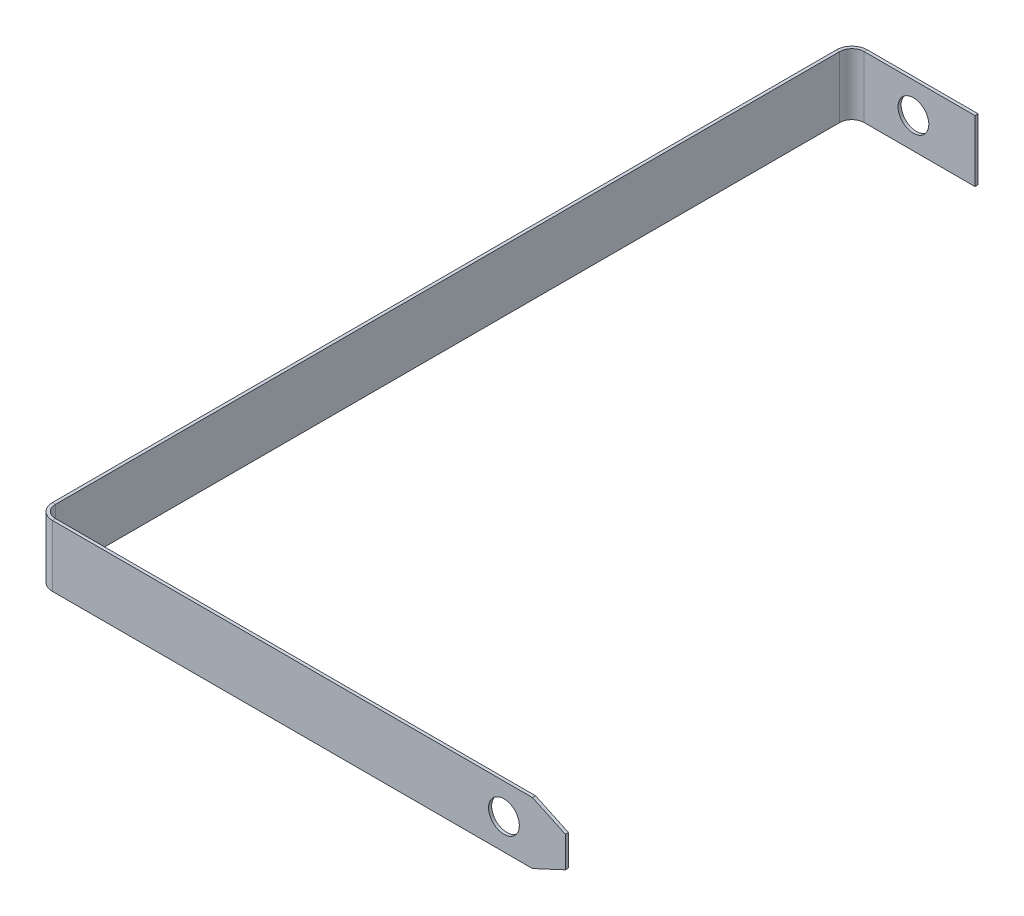
ISO-10303-21;
HEADER;
FILE_DESCRIPTION(('STEP AP214'),'2;1');
FILE_NAME('part.step','',(''),(''),'','','');
FILE_SCHEMA(('AUTOMOTIVE_DESIGN { 1 0 10303 214 1 1 1 1 }'));
ENDSEC;
DATA;
#1=APPLICATION_CONTEXT('core data for automotive mechanical design processes');
#2=APPLICATION_PROTOCOL_DEFINITION('international standard','automotive_design',2000,#1);
#3=PRODUCT_CONTEXT('',#1,'mechanical');
#4=PRODUCT('Part','Part','',(#3));
#5=PRODUCT_RELATED_PRODUCT_CATEGORY('part','',(#4));
#6=PRODUCT_DEFINITION_FORMATION('','',#4);
#7=PRODUCT_DEFINITION_CONTEXT('part definition',#1,'design');
#8=PRODUCT_DEFINITION('design','',#6,#7);
#9=PRODUCT_DEFINITION_SHAPE('','',#8);
#10=(LENGTH_UNIT() NAMED_UNIT(*) SI_UNIT(.MILLI.,.METRE.));
#11=(NAMED_UNIT(*) PLANE_ANGLE_UNIT() SI_UNIT($,.RADIAN.));
#12=(NAMED_UNIT(*) SI_UNIT($,.STERADIAN.) SOLID_ANGLE_UNIT());
#13=UNCERTAINTY_MEASURE_WITH_UNIT(LENGTH_MEASURE(1.E-05),#10,'distance_accuracy_value','');
#14=(GEOMETRIC_REPRESENTATION_CONTEXT(3) GLOBAL_UNCERTAINTY_ASSIGNED_CONTEXT((#13)) GLOBAL_UNIT_ASSIGNED_CONTEXT((#10,
#11,#12)) REPRESENTATION_CONTEXT('',''));
#15=CARTESIAN_POINT('',(0.,0.,0.));
#16=DIRECTION('',(0.,0.,1.));
#17=DIRECTION('',(1.,0.,0.));
#18=AXIS2_PLACEMENT_3D('',#15,#16,#17);
#19=CARTESIAN_POINT('',(-26.1699999999984,4.00000000000921,-3.39451983785322E-13));
#20=DIRECTION('',(-5.36737321255032E-13,-1.,0.));
#21=DIRECTION('',(0.,0.,-1.));
#22=AXIS2_PLACEMENT_3D('',#19,#20,#21);
#23=PLANE('',#22);
#24=DIRECTION('',(-1.,5.36737321255032E-13,0.));
#25=VECTOR('',#24,1.);
#26=CARTESIAN_POINT('',(-26.1699999999995,4.00000000000921,51.9999999999997));
#27=LINE('',#26,#25);
#28=CARTESIAN_POINT('',(-25.9699999999995,4.0000000000091,51.9999999999997));
#29=VERTEX_POINT('',#28);
#30=CARTESIAN_POINT('',(-26.1699999999995,4.00000000000921,51.9999999999997));
#31=VERTEX_POINT('',#30);
#32=EDGE_CURVE('E283',#29,#31,#27,.T.);
#33=ORIENTED_EDGE('',*,*,#32,.F.);
#34=DIRECTION('',(0.,0.,1.));
#35=VECTOR('',#34,1.);
#36=CARTESIAN_POINT('',(-25.9699999999984,4.00000000000911,-3.35409080406372E-13));
#37=LINE('',#36,#35);
#38=CARTESIAN_POINT('',(-25.9699999999984,4.00000000000911,0.999999999999664));
#39=VERTEX_POINT('',#38);
#40=EDGE_CURVE('E71',#29,#39,#37,.F.);
#41=ORIENTED_EDGE('',*,*,#40,.T.);
#42=DIRECTION('',(-1.,5.36737321255032E-13,0.));
#43=VECTOR('',#42,1.);
#44=CARTESIAN_POINT('',(-26.1699999999984,4.00000000000921,0.99999999999966));
#45=LINE('',#44,#43);
#46=CARTESIAN_POINT('',(-26.1699999999984,4.00000000000921,0.99999999999966));
#47=VERTEX_POINT('',#46);
#48=EDGE_CURVE('E289',#39,#47,#45,.T.);
#49=ORIENTED_EDGE('',*,*,#48,.T.);
#50=DIRECTION('',(0.,0.,-1.));
#51=VECTOR('',#50,1.);
#52=CARTESIAN_POINT('',(-26.1699999999984,4.00000000000921,-3.39451983785322E-13));
#53=LINE('',#52,#51);
#54=EDGE_CURVE('E268',#31,#47,#53,.T.);
#55=ORIENTED_EDGE('',*,*,#54,.F.);
#56=EDGE_LOOP('',(#33,#41,#49,#55));
#57=FACE_BOUND('',#56,.T.);
#58=ADVANCED_FACE('F49',(#57),#23,.F.);
#59=CARTESIAN_POINT('',(-26.1700000000006,9.21224901917483E-12,-3.39622397293124E-13));
#60=DIRECTION('',(-5.36737321255032E-13,-1.,0.));
#61=DIRECTION('',(0.,0.,-1.));
#62=AXIS2_PLACEMENT_3D('',#59,#60,#61);
#63=PLANE('',#62);
#64=DIRECTION('',(-1.,5.36737321255032E-13,0.));
#65=VECTOR('',#64,1.);
#66=CARTESIAN_POINT('',(-26.1700000000006,9.21224901917483E-12,0.99999999999966));
#67=LINE('',#66,#65);
#68=CARTESIAN_POINT('',(-25.9700000000006,9.10556352540226E-12,0.999999999999664));
#69=VERTEX_POINT('',#68);
#70=CARTESIAN_POINT('',(-26.1700000000006,9.21224901917483E-12,0.99999999999966));
#71=VERTEX_POINT('',#70);
#72=EDGE_CURVE('E11',#69,#71,#67,.T.);
#73=ORIENTED_EDGE('',*,*,#72,.F.);
#74=DIRECTION('',(0.,0.,1.));
#75=VECTOR('',#74,1.);
#76=CARTESIAN_POINT('',(-25.9700000000006,9.10556352540226E-12,-3.35579493914174E-13));
#77=LINE('',#76,#75);
#78=CARTESIAN_POINT('',(-25.9700000000016,9.1029614401883E-12,51.9999999999997));
#79=VERTEX_POINT('',#78);
#80=EDGE_CURVE('E63',#79,#69,#77,.F.);
#81=ORIENTED_EDGE('',*,*,#80,.F.);
#82=DIRECTION('',(-1.,5.36737321255032E-13,0.));
#83=VECTOR('',#82,1.);
#84=CARTESIAN_POINT('',(-26.1700000000016,9.20964693396087E-12,51.9999999999997));
#85=LINE('',#84,#83);
#86=CARTESIAN_POINT('',(-26.1700000000016,9.20964693396087E-12,51.9999999999997));
#87=VERTEX_POINT('',#86);
#88=EDGE_CURVE('E277',#79,#87,#85,.T.);
#89=ORIENTED_EDGE('',*,*,#88,.T.);
#90=DIRECTION('',(0.,0.,-1.));
#91=VECTOR('',#90,1.);
#92=CARTESIAN_POINT('',(-26.1700000000006,9.21224901917483E-12,-3.39622397293124E-13));
#93=LINE('',#92,#91);
#94=EDGE_CURVE('E270',#87,#71,#93,.T.);
#95=ORIENTED_EDGE('',*,*,#94,.T.);
#96=EDGE_LOOP('',(#73,#81,#89,#95));
#97=FACE_BOUND('',#96,.T.);
#98=ADVANCED_FACE('F356',(#97),#63,.T.);
#99=CARTESIAN_POINT('',(-26.1700000000006,9.21224901917483E-12,-3.39622397293124E-13));
#100=DIRECTION('',(1.,-5.36737321255032E-13,0.));
#101=DIRECTION('',(0.,0.,1.));
#102=AXIS2_PLACEMENT_3D('',#99,#100,#101);
#103=PLANE('',#102);
#104=ORIENTED_EDGE('',*,*,#54,.T.);
#105=DIRECTION('',(-5.36737321255032E-13,-1.,0.));
#106=VECTOR('',#105,1.);
#107=CARTESIAN_POINT('',(-26.1700000000006,9.21224901917483E-12,0.99999999999966));
#108=LINE('',#107,#106);
#109=EDGE_CURVE('E286',#47,#71,#108,.T.);
#110=ORIENTED_EDGE('',*,*,#109,.T.);
#111=ORIENTED_EDGE('',*,*,#94,.F.);
#112=DIRECTION('',(5.36737321255032E-13,1.,0.));
#113=VECTOR('',#112,1.);
#114=CARTESIAN_POINT('',(-26.1700000000016,9.20964693396087E-12,51.9999999999997));
#115=LINE('',#114,#113);
#116=EDGE_CURVE('E272',#87,#31,#115,.T.);
#117=ORIENTED_EDGE('',*,*,#116,.T.);
#118=EDGE_LOOP('',(#104,#110,#111,#117));
#119=FACE_BOUND('',#118,.T.);
#120=ADVANCED_FACE('F303',(#119),#103,.F.);
#121=CARTESIAN_POINT('',(-25.9700000000006,9.10556352540226E-12,-3.35579493914174E-13));
#122=DIRECTION('',(1.,-5.36737321255032E-13,0.));
#123=DIRECTION('',(0.,0.,1.));
#124=AXIS2_PLACEMENT_3D('',#121,#122,#123);
#125=PLANE('',#124);
#126=ORIENTED_EDGE('',*,*,#40,.F.);
#127=DIRECTION('',(5.36737321255032E-13,1.,0.));
#128=VECTOR('',#127,1.);
#129=CARTESIAN_POINT('',(-25.9700000000016,9.1029614401883E-12,51.9999999999997));
#130=LINE('',#129,#128);
#131=EDGE_CURVE('E280',#79,#29,#130,.T.);
#132=ORIENTED_EDGE('',*,*,#131,.F.);
#133=ORIENTED_EDGE('',*,*,#80,.T.);
#134=DIRECTION('',(-5.36737321255032E-13,-1.,0.));
#135=VECTOR('',#134,1.);
#136=CARTESIAN_POINT('',(-25.9700000000006,9.10556352540226E-12,0.999999999999664));
#137=LINE('',#136,#135);
#138=EDGE_CURVE('E56',#39,#69,#137,.T.);
#139=ORIENTED_EDGE('',*,*,#138,.F.);
#140=EDGE_LOOP('',(#126,#132,#133,#139));
#141=FACE_BOUND('',#140,.T.);
#142=ADVANCED_FACE('F296',(#141),#125,.T.);
#143=CARTESIAN_POINT('',(-25.1699999999995,4.00000000000867,51.9999999999997));
#144=DIRECTION('',(5.36737321255032E-13,1.,0.));
#145=DIRECTION('',(0.,0.,-1.));
#146=AXIS2_PLACEMENT_3D('',#143,#144,#145);
#147=PLANE('',#146);
#148=DIRECTION('',(0.,0.,1.));
#149=VECTOR('',#148,1.);
#150=CARTESIAN_POINT('',(-25.1699999999995,4.00000000000867,52.9999999999997));
#151=LINE('',#150,#149);
#152=CARTESIAN_POINT('',(-25.1699999999995,4.00000000000867,52.7999999999997));
#153=VERTEX_POINT('',#152);
#154=CARTESIAN_POINT('',(-25.1699999999995,4.00000000000867,52.9999999999997));
#155=VERTEX_POINT('',#154);
#156=EDGE_CURVE('E211',#153,#155,#151,.T.);
#157=ORIENTED_EDGE('',*,*,#156,.F.);
#158=CARTESIAN_POINT('',(-25.1699999999995,4.00000000000867,51.9999999999997));
#159=DIRECTION('',(5.36737321255032E-13,1.,0.));
#160=DIRECTION('',(0.,0.,-1.));
#161=AXIS2_PLACEMENT_3D('',#158,#159,#160);
#162=CIRCLE('',#161,0.8);
#163=EDGE_CURVE('E214',#153,#29,#162,.F.);
#164=ORIENTED_EDGE('',*,*,#163,.T.);
#165=ORIENTED_EDGE('',*,*,#32,.T.);
#166=CARTESIAN_POINT('',(-25.1699999999995,4.00000000000867,51.9999999999997));
#167=DIRECTION('',(-5.36737321255032E-13,-1.,0.));
#168=DIRECTION('',(0.,0.,1.));
#169=AXIS2_PLACEMENT_3D('',#166,#167,#168);
#170=CIRCLE('',#169,1.);
#171=EDGE_CURVE('E257',#155,#31,#170,.T.);
#172=ORIENTED_EDGE('',*,*,#171,.F.);
#173=EDGE_LOOP('',(#157,#164,#165,#172));
#174=FACE_BOUND('',#173,.T.);
#175=ADVANCED_FACE('F309',(#174),#147,.T.);
#176=CARTESIAN_POINT('',(-25.1700000000016,8.67275001814605E-12,51.9999999999997));
#177=DIRECTION('',(-5.36737321255032E-13,-1.,0.));
#178=DIRECTION('',(0.,0.,1.));
#179=AXIS2_PLACEMENT_3D('',#176,#177,#178);
#180=PLANE('',#179);
#181=ORIENTED_EDGE('',*,*,#88,.F.);
#182=CARTESIAN_POINT('',(-25.1700000000016,8.67275001814605E-12,51.9999999999997));
#183=DIRECTION('',(5.36737321255032E-13,1.,0.));
#184=DIRECTION('',(0.,0.,-1.));
#185=AXIS2_PLACEMENT_3D('',#182,#183,#184);
#186=CIRCLE('',#185,0.8);
#187=CARTESIAN_POINT('',(-25.1700000000016,8.67275001814605E-12,52.7999999999997));
#188=VERTEX_POINT('',#187);
#189=EDGE_CURVE('E261',#79,#188,#186,.T.);
#190=ORIENTED_EDGE('',*,*,#189,.T.);
#191=DIRECTION('',(0.,0.,1.));
#192=VECTOR('',#191,1.);
#193=CARTESIAN_POINT('',(-25.1700000000016,8.67275001814605E-12,52.9999999999997));
#194=LINE('',#193,#192);
#195=CARTESIAN_POINT('',(-25.1700000000016,8.67275001814605E-12,52.9999999999997));
#196=VERTEX_POINT('',#195);
#197=EDGE_CURVE('E252',#188,#196,#194,.T.);
#198=ORIENTED_EDGE('',*,*,#197,.T.);
#199=CARTESIAN_POINT('',(-25.1700000000016,8.67275001814605E-12,51.9999999999997));
#200=DIRECTION('',(5.36737321255032E-13,1.,0.));
#201=DIRECTION('',(0.,0.,-1.));
#202=AXIS2_PLACEMENT_3D('',#199,#200,#201);
#203=CIRCLE('',#202,1.);
#204=EDGE_CURVE('E260',#87,#196,#203,.T.);
#205=ORIENTED_EDGE('',*,*,#204,.F.);
#206=EDGE_LOOP('',(#181,#190,#198,#205));
#207=FACE_BOUND('',#206,.T.);
#208=ADVANCED_FACE('F325',(#207),#180,.T.);
#209=CARTESIAN_POINT('',(-25.1700000000028,-2.24718670311854,51.9999999999997));
#210=DIRECTION('',(5.36737321255032E-13,1.,0.));
#211=DIRECTION('',(0.,0.,-1.));
#212=AXIS2_PLACEMENT_3D('',#209,#210,#211);
#213=CYLINDRICAL_SURFACE('',#212,1.);
#214=ORIENTED_EDGE('',*,*,#204,.T.);
#215=DIRECTION('',(-5.36737321255032E-13,-1.,0.));
#216=VECTOR('',#215,1.);
#217=CARTESIAN_POINT('',(-25.1700000000016,8.67275001814605E-12,52.9999999999997));
#218=LINE('',#217,#216);
#219=EDGE_CURVE('E230',#155,#196,#218,.T.);
#220=ORIENTED_EDGE('',*,*,#219,.F.);
#221=ORIENTED_EDGE('',*,*,#171,.T.);
#222=ORIENTED_EDGE('',*,*,#116,.F.);
#223=EDGE_LOOP('',(#214,#220,#221,#222));
#224=FACE_BOUND('',#223,.T.);
#225=ADVANCED_FACE('F312',(#224),#213,.T.);
#226=CARTESIAN_POINT('',(-25.1700000000028,-2.24718670311854,51.9999999999997));
#227=DIRECTION('',(5.36737321255032E-13,1.,0.));
#228=DIRECTION('',(0.,0.,-1.));
#229=AXIS2_PLACEMENT_3D('',#226,#227,#228);
#230=CYLINDRICAL_SURFACE('',#229,0.8);
#231=ORIENTED_EDGE('',*,*,#189,.F.);
#232=ORIENTED_EDGE('',*,*,#131,.T.);
#233=ORIENTED_EDGE('',*,*,#163,.F.);
#234=DIRECTION('',(-5.36737321255032E-13,-1.,0.));
#235=VECTOR('',#234,1.);
#236=CARTESIAN_POINT('',(-25.1700000000016,8.67275001814605E-12,52.7999999999997));
#237=LINE('',#236,#235);
#238=EDGE_CURVE('E205',#153,#188,#237,.T.);
#239=ORIENTED_EDGE('',*,*,#238,.T.);
#240=EDGE_LOOP('',(#231,#232,#233,#239));
#241=FACE_BOUND('',#240,.T.);
#242=ADVANCED_FACE('F329',(#241),#230,.F.);
#243=CARTESIAN_POINT('',(8.19999999999999,2.99999999999076,53.0000000000004));
#244=DIRECTION('',(0.42261826174118,0.906307787036426,0.));
#245=DIRECTION('',(0.906307787036426,-0.42261826174118,0.));
#246=AXIS2_PLACEMENT_3D('',#243,#244,#245);
#247=PLANE('',#246);
#248=DIRECTION('',(0.,0.,1.));
#249=VECTOR('',#248,1.);
#250=CARTESIAN_POINT('',(8.19999999999999,2.99999999999076,53.0000000000004));
#251=LINE('',#250,#249);
#252=CARTESIAN_POINT('',(8.19999999999999,2.99999999999076,52.8000000000004));
#253=VERTEX_POINT('',#252);
#254=CARTESIAN_POINT('',(8.19999999999999,2.99999999999076,53.0000000000004));
#255=VERTEX_POINT('',#254);
#256=EDGE_CURVE('E242',#253,#255,#251,.T.);
#257=ORIENTED_EDGE('',*,*,#256,.F.);
#258=DIRECTION('',(0.906307787036426,-0.42261826174118,0.));
#259=VECTOR('',#258,1.);
#260=CARTESIAN_POINT('',(8.19999999999999,2.99999999999076,52.8000000000004));
#261=LINE('',#260,#259);
#262=CARTESIAN_POINT('',(6.05549307949094,3.99999999999191,52.8000000000003));
#263=VERTEX_POINT('',#262);
#264=EDGE_CURVE('E220',#263,#253,#261,.T.);
#265=ORIENTED_EDGE('',*,*,#264,.F.);
#266=DIRECTION('',(0.,0.,1.));
#267=VECTOR('',#266,1.);
#268=CARTESIAN_POINT('',(6.05549307949093,3.99999999999191,53.0000000000003));
#269=LINE('',#268,#267);
#270=CARTESIAN_POINT('',(6.05549307949093,3.99999999999191,53.0000000000003));
#271=VERTEX_POINT('',#270);
#272=EDGE_CURVE('E250',#263,#271,#269,.T.);
#273=ORIENTED_EDGE('',*,*,#272,.T.);
#274=DIRECTION('',(0.906307787036426,-0.42261826174118,0.));
#275=VECTOR('',#274,1.);
#276=CARTESIAN_POINT('',(8.19999999999999,2.99999999999076,53.0000000000004));
#277=LINE('',#276,#275);
#278=EDGE_CURVE('E247',#271,#255,#277,.T.);
#279=ORIENTED_EDGE('',*,*,#278,.T.);
#280=EDGE_LOOP('',(#257,#265,#273,#279));
#281=FACE_BOUND('',#280,.T.);
#282=ADVANCED_FACE('F337',(#281),#247,.T.);
#283=CARTESIAN_POINT('',(8.19999999999838,-9.2374025095765E-12,53.0000000000004));
#284=DIRECTION('',(-1.,5.36737321255032E-13,0.));
#285=DIRECTION('',(5.36737321255032E-13,1.,0.));
#286=AXIS2_PLACEMENT_3D('',#283,#284,#285);
#287=PLANE('',#286);
#288=DIRECTION('',(0.,0.,1.));
#289=VECTOR('',#288,1.);
#290=CARTESIAN_POINT('',(8.19999999999891,0.999999999990763,53.0000000000004));
#291=LINE('',#290,#289);
#292=CARTESIAN_POINT('',(8.19999999999892,0.999999999990763,52.8000000000004));
#293=VERTEX_POINT('',#292);
#294=CARTESIAN_POINT('',(8.19999999999891,0.999999999990763,53.0000000000004));
#295=VERTEX_POINT('',#294);
#296=EDGE_CURVE('E240',#293,#295,#291,.T.);
#297=ORIENTED_EDGE('',*,*,#296,.F.);
#298=DIRECTION('',(-5.36737321255032E-13,-1.,0.));
#299=VECTOR('',#298,1.);
#300=CARTESIAN_POINT('',(8.19999999999838,-9.2374025095765E-12,52.8000000000004));
#301=LINE('',#300,#299);
#302=EDGE_CURVE('E244',#293,#253,#301,.F.);
#303=ORIENTED_EDGE('',*,*,#302,.T.);
#304=ORIENTED_EDGE('',*,*,#256,.T.);
#305=DIRECTION('',(5.36737321255032E-13,1.,0.));
#306=VECTOR('',#305,1.);
#307=CARTESIAN_POINT('',(8.19999999999838,-9.2374025095765E-12,53.0000000000004));
#308=LINE('',#307,#306);
#309=EDGE_CURVE('E234',#295,#255,#308,.T.);
#310=ORIENTED_EDGE('',*,*,#309,.F.);
#311=EDGE_LOOP('',(#297,#303,#304,#310));
#312=FACE_BOUND('',#311,.T.);
#313=ADVANCED_FACE('F340',(#312),#287,.F.);
#314=CARTESIAN_POINT('',(8.19999999999891,0.999999999990763,53.0000000000004));
#315=DIRECTION('',(0.422618261740208,-0.90630778703688,0.));
#316=DIRECTION('',(-0.90630778703688,-0.422618261740208,0.));
#317=AXIS2_PLACEMENT_3D('',#314,#315,#316);
#318=PLANE('',#317);
#319=DIRECTION('',(0.,0.,1.));
#320=VECTOR('',#319,1.);
#321=CARTESIAN_POINT('',(6.05549307948879,-8.08641348326589E-12,53.0000000000003));
#322=LINE('',#321,#320);
#323=CARTESIAN_POINT('',(6.05549307948879,-8.08641348326589E-12,52.8000000000003));
#324=VERTEX_POINT('',#323);
#325=CARTESIAN_POINT('',(6.05549307948879,-8.08641348326589E-12,53.0000000000003));
#326=VERTEX_POINT('',#325);
#327=EDGE_CURVE('E228',#324,#326,#322,.T.);
#328=ORIENTED_EDGE('',*,*,#327,.F.);
#329=DIRECTION('',(-0.90630778703688,-0.422618261740208,0.));
#330=VECTOR('',#329,1.);
#331=CARTESIAN_POINT('',(8.19999999999892,0.999999999990763,52.8000000000004));
#332=LINE('',#331,#330);
#333=EDGE_CURVE('E217',#293,#324,#332,.T.);
#334=ORIENTED_EDGE('',*,*,#333,.F.);
#335=ORIENTED_EDGE('',*,*,#296,.T.);
#336=DIRECTION('',(-0.90630778703688,-0.422618261740208,0.));
#337=VECTOR('',#336,1.);
#338=CARTESIAN_POINT('',(8.19999999999891,0.999999999990763,53.0000000000004));
#339=LINE('',#338,#337);
#340=EDGE_CURVE('E237',#295,#326,#339,.T.);
#341=ORIENTED_EDGE('',*,*,#340,.T.);
#342=EDGE_LOOP('',(#328,#334,#335,#341));
#343=FACE_BOUND('',#342,.T.);
#344=ADVANCED_FACE('F344',(#343),#318,.T.);
#345=CARTESIAN_POINT('',(-26.1700000000016,9.20964693396087E-12,52.9999999999997));
#346=DIRECTION('',(0.,0.,-1.));
#347=DIRECTION('',(1.,-5.36737321255032E-13,0.));
#348=AXIS2_PLACEMENT_3D('',#345,#346,#347);
#349=PLANE('',#348);
#350=CARTESIAN_POINT('',(4.19999999999945,1.99999999999291,53.0000000000003));
#351=DIRECTION('',(0.,0.,-1.));
#352=DIRECTION('',(1.,-5.36737321255032E-13,0.));
#353=AXIS2_PLACEMENT_3D('',#350,#351,#352);
#354=CIRCLE('',#353,1.);
#355=CARTESIAN_POINT('',(5.19999999999945,1.99999999999237,53.0000000000003));
#356=VERTEX_POINT('',#355);
#357=EDGE_CURVE('E197',#356,#356,#354,.T.);
#358=ORIENTED_EDGE('',*,*,#357,.T.);
#359=EDGE_LOOP('',(#358));
#360=FACE_BOUND('',#359,.T.);
#361=DIRECTION('',(-1.,5.36737321255032E-13,0.));
#362=VECTOR('',#361,1.);
#363=CARTESIAN_POINT('',(-26.1700000000016,9.20964693396087E-12,52.9999999999997));
#364=LINE('',#363,#362);
#365=EDGE_CURVE('E225',#326,#196,#364,.T.);
#366=ORIENTED_EDGE('',*,*,#365,.F.);
#367=ORIENTED_EDGE('',*,*,#340,.F.);
#368=ORIENTED_EDGE('',*,*,#309,.T.);
#369=ORIENTED_EDGE('',*,*,#278,.F.);
#370=DIRECTION('',(-1.,5.36737321255032E-13,0.));
#371=VECTOR('',#370,1.);
#372=CARTESIAN_POINT('',(-26.1699999999995,4.00000000000921,52.9999999999997));
#373=LINE('',#372,#371);
#374=EDGE_CURVE('E232',#271,#155,#373,.T.);
#375=ORIENTED_EDGE('',*,*,#374,.T.);
#376=ORIENTED_EDGE('',*,*,#219,.T.);
#377=EDGE_LOOP('',(#366,#367,#368,#369,#375,#376));
#378=FACE_BOUND('',#377,.T.);
#379=ADVANCED_FACE('F315',(#360,#378),#349,.F.);
#380=CARTESIAN_POINT('',(-26.1700000000016,9.20964693396087E-12,52.9999999999997));
#381=DIRECTION('',(-5.36737321255032E-13,-1.,0.));
#382=DIRECTION('',(-1.,5.36737321255032E-13,0.));
#383=AXIS2_PLACEMENT_3D('',#380,#381,#382);
#384=PLANE('',#383);
#385=DIRECTION('',(1.,-5.36737321255032E-13,0.));
#386=VECTOR('',#385,1.);
#387=CARTESIAN_POINT('',(-26.1700000000016,9.20964693396087E-12,52.7999999999997));
#388=LINE('',#387,#386);
#389=EDGE_CURVE('E223',#324,#188,#388,.F.);
#390=ORIENTED_EDGE('',*,*,#389,.F.);
#391=ORIENTED_EDGE('',*,*,#327,.T.);
#392=ORIENTED_EDGE('',*,*,#365,.T.);
#393=ORIENTED_EDGE('',*,*,#197,.F.);
#394=EDGE_LOOP('',(#390,#391,#392,#393));
#395=FACE_BOUND('',#394,.T.);
#396=ADVANCED_FACE('F322',(#395),#384,.T.);
#397=CARTESIAN_POINT('',(-26.1700000000016,9.20964693396087E-12,52.7999999999997));
#398=DIRECTION('',(0.,0.,-1.));
#399=DIRECTION('',(1.,-5.36737321255032E-13,0.));
#400=AXIS2_PLACEMENT_3D('',#397,#398,#399);
#401=PLANE('',#400);
#402=CARTESIAN_POINT('',(4.19999999999945,1.99999999999291,52.8000000000003));
#403=DIRECTION('',(0.,0.,-1.));
#404=DIRECTION('',(1.,-5.36737321255032E-13,0.));
#405=AXIS2_PLACEMENT_3D('',#402,#403,#404);
#406=CIRCLE('',#405,1.);
#407=CARTESIAN_POINT('',(5.19999999999945,1.99999999999237,52.8000000000003));
#408=VERTEX_POINT('',#407);
#409=EDGE_CURVE('E610',#408,#408,#406,.T.);
#410=ORIENTED_EDGE('',*,*,#409,.F.);
#411=EDGE_LOOP('',(#410));
#412=FACE_BOUND('',#411,.T.);
#413=ORIENTED_EDGE('',*,*,#389,.T.);
#414=ORIENTED_EDGE('',*,*,#238,.F.);
#415=DIRECTION('',(1.,-5.36737321255032E-13,0.));
#416=VECTOR('',#415,1.);
#417=CARTESIAN_POINT('',(-26.1699999999995,4.00000000000921,52.7999999999997));
#418=LINE('',#417,#416);
#419=EDGE_CURVE('E215',#263,#153,#418,.F.);
#420=ORIENTED_EDGE('',*,*,#419,.F.);
#421=ORIENTED_EDGE('',*,*,#264,.T.);
#422=ORIENTED_EDGE('',*,*,#302,.F.);
#423=ORIENTED_EDGE('',*,*,#333,.T.);
#424=EDGE_LOOP('',(#413,#414,#420,#421,#422,#423));
#425=FACE_BOUND('',#424,.T.);
#426=ADVANCED_FACE('F332',(#412,#425),#401,.T.);
#427=CARTESIAN_POINT('',(-26.1699999999995,4.00000000000921,52.9999999999997));
#428=DIRECTION('',(-5.36737321255032E-13,-1.,0.));
#429=DIRECTION('',(-1.,5.36737321255032E-13,0.));
#430=AXIS2_PLACEMENT_3D('',#427,#428,#429);
#431=PLANE('',#430);
#432=ORIENTED_EDGE('',*,*,#272,.F.);
#433=ORIENTED_EDGE('',*,*,#419,.T.);
#434=ORIENTED_EDGE('',*,*,#156,.T.);
#435=ORIENTED_EDGE('',*,*,#374,.F.);
#436=EDGE_LOOP('',(#432,#433,#434,#435));
#437=FACE_BOUND('',#436,.T.);
#438=ADVANCED_FACE('F335',(#437),#431,.F.);
#439=CARTESIAN_POINT('',(-25.1699999999984,4.00000000000868,0.999999999999681));
#440=DIRECTION('',(5.36737321255032E-13,1.,0.));
#441=DIRECTION('',(0.,0.,-1.));
#442=AXIS2_PLACEMENT_3D('',#439,#440,#441);
#443=PLANE('',#442);
#444=ORIENTED_EDGE('',*,*,#48,.F.);
#445=CARTESIAN_POINT('',(-25.1699999999984,4.00000000000868,0.999999999999681));
#446=DIRECTION('',(-5.36737321255032E-13,-1.,0.));
#447=DIRECTION('',(0.,0.,1.));
#448=AXIS2_PLACEMENT_3D('',#445,#446,#447);
#449=CIRCLE('',#448,0.8);
#450=CARTESIAN_POINT('',(-25.1699999999984,4.00000000000868,0.199999999999679));
#451=VERTEX_POINT('',#450);
#452=EDGE_CURVE('E208',#39,#451,#449,.T.);
#453=ORIENTED_EDGE('',*,*,#452,.T.);
#454=DIRECTION('',(0.,0.,-1.));
#455=VECTOR('',#454,1.);
#456=CARTESIAN_POINT('',(-25.1699999999984,4.00000000000868,-3.19368389417059E-13));
#457=LINE('',#456,#455);
#458=CARTESIAN_POINT('',(-25.1699999999984,4.00000000000868,-3.19368389417059E-13));
#459=VERTEX_POINT('',#458);
#460=EDGE_CURVE('E161',#451,#459,#457,.T.);
#461=ORIENTED_EDGE('',*,*,#460,.T.);
#462=CARTESIAN_POINT('',(-25.1699999999984,4.00000000000868,0.999999999999681));
#463=DIRECTION('',(-5.36737321255032E-13,-1.,0.));
#464=DIRECTION('',(0.,0.,1.));
#465=AXIS2_PLACEMENT_3D('',#462,#463,#464);
#466=CIRCLE('',#465,1.);
#467=EDGE_CURVE('E198',#47,#459,#466,.T.);
#468=ORIENTED_EDGE('',*,*,#467,.F.);
#469=EDGE_LOOP('',(#444,#453,#461,#468));
#470=FACE_BOUND('',#469,.T.);
#471=ADVANCED_FACE('F299',(#470),#443,.T.);
#472=CARTESIAN_POINT('',(-25.1700000000006,8.67535210336001E-12,0.99999999999968));
#473=DIRECTION('',(-5.36737321255032E-13,-1.,0.));
#474=DIRECTION('',(0.,0.,1.));
#475=AXIS2_PLACEMENT_3D('',#472,#473,#474);
#476=PLANE('',#475);
#477=DIRECTION('',(0.,0.,-1.));
#478=VECTOR('',#477,1.);
#479=CARTESIAN_POINT('',(-25.1700000000006,8.67535210336001E-12,-3.19538802924861E-13));
#480=LINE('',#479,#478);
#481=CARTESIAN_POINT('',(-25.1700000000006,8.67535210336001E-12,0.199999999999679));
#482=VERTEX_POINT('',#481);
#483=CARTESIAN_POINT('',(-25.1700000000006,8.67535210336001E-12,-3.19538802924861E-13));
#484=VERTEX_POINT('',#483);
#485=EDGE_CURVE('E174',#482,#484,#480,.T.);
#486=ORIENTED_EDGE('',*,*,#485,.F.);
#487=CARTESIAN_POINT('',(-25.1700000000006,8.67535210336001E-12,0.99999999999968));
#488=DIRECTION('',(-5.36737321255032E-13,-1.,0.));
#489=DIRECTION('',(0.,0.,1.));
#490=AXIS2_PLACEMENT_3D('',#487,#488,#489);
#491=CIRCLE('',#490,0.8);
#492=EDGE_CURVE('E202',#482,#69,#491,.F.);
#493=ORIENTED_EDGE('',*,*,#492,.T.);
#494=ORIENTED_EDGE('',*,*,#72,.T.);
#495=CARTESIAN_POINT('',(-25.1700000000006,8.67535210336001E-12,0.99999999999968));
#496=DIRECTION('',(5.36737321255032E-13,1.,0.));
#497=DIRECTION('',(0.,0.,-1.));
#498=AXIS2_PLACEMENT_3D('',#495,#496,#497);
#499=CIRCLE('',#498,1.);
#500=EDGE_CURVE('E201',#484,#71,#499,.T.);
#501=ORIENTED_EDGE('',*,*,#500,.F.);
#502=EDGE_LOOP('',(#486,#493,#494,#501));
#503=FACE_BOUND('',#502,.T.);
#504=ADVANCED_FACE('F476',(#503),#476,.T.);
#505=CARTESIAN_POINT('',(-25.1699999999972,6.24718670313589,0.999999999999681));
#506=DIRECTION('',(-5.36737321255032E-13,-1.,0.));
#507=DIRECTION('',(0.,0.,1.));
#508=AXIS2_PLACEMENT_3D('',#505,#506,#507);
#509=CYLINDRICAL_SURFACE('',#508,1.);
#510=ORIENTED_EDGE('',*,*,#500,.T.);
#511=ORIENTED_EDGE('',*,*,#109,.F.);
#512=ORIENTED_EDGE('',*,*,#467,.T.);
#513=DIRECTION('',(5.36737321255032E-13,1.,0.));
#514=VECTOR('',#513,1.);
#515=CARTESIAN_POINT('',(-25.1700000000006,8.67535210336001E-12,-3.19538802924861E-13));
#516=LINE('',#515,#514);
#517=EDGE_CURVE('E185',#484,#459,#516,.T.);
#518=ORIENTED_EDGE('',*,*,#517,.F.);
#519=EDGE_LOOP('',(#510,#511,#512,#518));
#520=FACE_BOUND('',#519,.T.);
#521=ADVANCED_FACE('F473',(#520),#509,.T.);
#522=CARTESIAN_POINT('',(-25.1699999999972,6.24718670313589,0.999999999999681));
#523=DIRECTION('',(-5.36737321255032E-13,-1.,0.));
#524=DIRECTION('',(0.,0.,1.));
#525=AXIS2_PLACEMENT_3D('',#522,#523,#524);
#526=CYLINDRICAL_SURFACE('',#525,0.8);
#527=ORIENTED_EDGE('',*,*,#492,.F.);
#528=DIRECTION('',(5.36737321255032E-13,1.,0.));
#529=VECTOR('',#528,1.);
#530=CARTESIAN_POINT('',(-25.1700000000006,8.67535210336001E-12,0.199999999999679));
#531=LINE('',#530,#529);
#532=EDGE_CURVE('E169',#482,#451,#531,.T.);
#533=ORIENTED_EDGE('',*,*,#532,.T.);
#534=ORIENTED_EDGE('',*,*,#452,.F.);
#535=ORIENTED_EDGE('',*,*,#138,.T.);
#536=EDGE_LOOP('',(#527,#533,#534,#535));
#537=FACE_BOUND('',#536,.T.);
#538=ADVANCED_FACE('F294',(#537),#526,.F.);
#539=CARTESIAN_POINT('',(-17.9700000000006,4.81125556062167E-12,-1.74936923473367E-13));
#540=DIRECTION('',(1.,-5.36737321255032E-13,0.));
#541=DIRECTION('',(5.36737321255032E-13,1.,0.));
#542=AXIS2_PLACEMENT_3D('',#539,#540,#541);
#543=PLANE('',#542);
#544=DIRECTION('',(0.,0.,-1.));
#545=VECTOR('',#544,1.);
#546=CARTESIAN_POINT('',(-17.9699999999984,4.00000000000481,-1.74766509965565E-13));
#547=LINE('',#546,#545);
#548=CARTESIAN_POINT('',(-17.9699999999984,4.00000000000481,0.199999999999826));
#549=VERTEX_POINT('',#548);
#550=CARTESIAN_POINT('',(-17.9699999999984,4.00000000000481,-1.74766509965565E-13));
#551=VERTEX_POINT('',#550);
#552=EDGE_CURVE('E171',#549,#551,#547,.T.);
#553=ORIENTED_EDGE('',*,*,#552,.F.);
#554=DIRECTION('',(-5.36737321255032E-13,-1.,0.));
#555=VECTOR('',#554,1.);
#556=CARTESIAN_POINT('',(-17.9700000000006,4.81125556062167E-12,0.199999999999826));
#557=LINE('',#556,#555);
#558=CARTESIAN_POINT('',(-17.9700000000006,4.81125556062167E-12,0.199999999999826));
#559=VERTEX_POINT('',#558);
#560=EDGE_CURVE('E166',#559,#549,#557,.F.);
#561=ORIENTED_EDGE('',*,*,#560,.F.);
#562=DIRECTION('',(0.,0.,-1.));
#563=VECTOR('',#562,1.);
#564=CARTESIAN_POINT('',(-17.9700000000006,4.81125556062167E-12,-1.74936923473367E-13));
#565=LINE('',#564,#563);
#566=CARTESIAN_POINT('',(-17.9700000000006,4.81125556062167E-12,-1.74936923473367E-13));
#567=VERTEX_POINT('',#566);
#568=EDGE_CURVE('E149',#559,#567,#565,.T.);
#569=ORIENTED_EDGE('',*,*,#568,.T.);
#570=DIRECTION('',(5.36737321255032E-13,1.,0.));
#571=VECTOR('',#570,1.);
#572=CARTESIAN_POINT('',(-17.9700000000006,4.81125556062167E-12,-1.74936923473367E-13));
#573=LINE('',#572,#571);
#574=EDGE_CURVE('E160',#567,#551,#573,.T.);
#575=ORIENTED_EDGE('',*,*,#574,.T.);
#576=EDGE_LOOP('',(#553,#561,#569,#575));
#577=FACE_BOUND('',#576,.T.);
#578=ADVANCED_FACE('F173',(#577),#543,.T.);
#579=CARTESIAN_POINT('',(-21.9699999999995,2.00000000000696,-2.69063882000333E-13));
#580=DIRECTION('',(0.,0.,1.));
#581=DIRECTION('',(-1.,5.36737321255032E-13,0.));
#582=AXIS2_PLACEMENT_3D('',#579,#580,#581);
#583=CYLINDRICAL_SURFACE('',#582,1.);
#584=CARTESIAN_POINT('',(-21.9699999999995,2.00000000000696,-2.69063882000333E-13));
#585=DIRECTION('',(0.,0.,1.));
#586=DIRECTION('',(-1.,5.36737321255032E-13,0.));
#587=AXIS2_PLACEMENT_3D('',#584,#585,#586);
#588=CIRCLE('',#587,1.);
#589=CARTESIAN_POINT('',(-22.9699999999995,2.0000000000075,-2.89147476368596E-13));
#590=VERTEX_POINT('',#589);
#591=EDGE_CURVE('E187',#590,#590,#588,.T.);
#592=ORIENTED_EDGE('',*,*,#591,.F.);
#593=EDGE_LOOP('',(#592));
#594=FACE_BOUND('',#593,.T.);
#595=CARTESIAN_POINT('',(-21.9699999999995,2.00000000000696,0.199999999999745));
#596=DIRECTION('',(0.,0.,1.));
#597=DIRECTION('',(-1.,5.36737321255032E-13,0.));
#598=AXIS2_PLACEMENT_3D('',#595,#596,#597);
#599=CIRCLE('',#598,1.);
#600=CARTESIAN_POINT('',(-22.9699999999995,2.0000000000075,0.199999999999725));
#601=VERTEX_POINT('',#600);
#602=EDGE_CURVE('E190',#601,#601,#599,.T.);
#603=ORIENTED_EDGE('',*,*,#602,.T.);
#604=EDGE_LOOP('',(#603));
#605=FACE_BOUND('',#604,.T.);
#606=ADVANCED_FACE('F394',(#594,#605),#583,.F.);
#607=CARTESIAN_POINT('',(-17.9700000000006,4.81125556062167E-12,-1.74936923473367E-13));
#608=DIRECTION('',(0.,0.,1.));
#609=DIRECTION('',(-1.,5.36737321255032E-13,0.));
#610=AXIS2_PLACEMENT_3D('',#607,#608,#609);
#611=PLANE('',#610);
#612=ORIENTED_EDGE('',*,*,#591,.T.);
#613=EDGE_LOOP('',(#612));
#614=FACE_BOUND('',#613,.T.);
#615=DIRECTION('',(1.,-5.36737321255032E-13,0.));
#616=VECTOR('',#615,1.);
#617=CARTESIAN_POINT('',(-17.9700000000006,4.81125556062167E-12,-1.74936923473367E-13));
#618=LINE('',#617,#616);
#619=EDGE_CURVE('E155',#484,#567,#618,.T.);
#620=ORIENTED_EDGE('',*,*,#619,.F.);
#621=ORIENTED_EDGE('',*,*,#517,.T.);
#622=DIRECTION('',(1.,-5.36737321255032E-13,0.));
#623=VECTOR('',#622,1.);
#624=CARTESIAN_POINT('',(-17.9699999999984,4.00000000000481,-1.74766509965565E-13));
#625=LINE('',#624,#623);
#626=EDGE_CURVE('E182',#459,#551,#625,.T.);
#627=ORIENTED_EDGE('',*,*,#626,.T.);
#628=ORIENTED_EDGE('',*,*,#574,.F.);
#629=EDGE_LOOP('',(#620,#621,#627,#628));
#630=FACE_BOUND('',#629,.T.);
#631=ADVANCED_FACE('F402',(#614,#630),#611,.F.);
#632=CARTESIAN_POINT('',(-17.9699999999984,4.00000000000481,-1.74766509965565E-13));
#633=DIRECTION('',(-5.36737321255032E-13,-1.,0.));
#634=DIRECTION('',(1.,-5.36737321255032E-13,0.));
#635=AXIS2_PLACEMENT_3D('',#632,#633,#634);
#636=PLANE('',#635);
#637=ORIENTED_EDGE('',*,*,#460,.F.);
#638=DIRECTION('',(-1.,5.36737321255032E-13,0.));
#639=VECTOR('',#638,1.);
#640=CARTESIAN_POINT('',(-17.9699999999984,4.00000000000481,0.199999999999826));
#641=LINE('',#640,#639);
#642=EDGE_CURVE('E180',#451,#549,#641,.F.);
#643=ORIENTED_EDGE('',*,*,#642,.T.);
#644=ORIENTED_EDGE('',*,*,#552,.T.);
#645=ORIENTED_EDGE('',*,*,#626,.F.);
#646=EDGE_LOOP('',(#637,#643,#644,#645));
#647=FACE_BOUND('',#646,.T.);
#648=ADVANCED_FACE('F399',(#647),#636,.F.);
#649=CARTESIAN_POINT('',(-17.9700000000006,4.81125556062167E-12,0.199999999999826));
#650=DIRECTION('',(0.,0.,1.));
#651=DIRECTION('',(-1.,5.36737321255032E-13,0.));
#652=AXIS2_PLACEMENT_3D('',#649,#650,#651);
#653=PLANE('',#652);
#654=ORIENTED_EDGE('',*,*,#602,.F.);
#655=EDGE_LOOP('',(#654));
#656=FACE_BOUND('',#655,.T.);
#657=DIRECTION('',(-1.,5.36737321255032E-13,0.));
#658=VECTOR('',#657,1.);
#659=CARTESIAN_POINT('',(-17.9700000000006,4.81125556062167E-12,0.199999999999826));
#660=LINE('',#659,#658);
#661=EDGE_CURVE('E152',#482,#559,#660,.F.);
#662=ORIENTED_EDGE('',*,*,#661,.T.);
#663=ORIENTED_EDGE('',*,*,#560,.T.);
#664=ORIENTED_EDGE('',*,*,#642,.F.);
#665=ORIENTED_EDGE('',*,*,#532,.F.);
#666=EDGE_LOOP('',(#662,#663,#664,#665));
#667=FACE_BOUND('',#666,.T.);
#668=ADVANCED_FACE('F165',(#656,#667),#653,.T.);
#669=CARTESIAN_POINT('',(-17.9700000000006,4.81125556062167E-12,-1.74936923473367E-13));
#670=DIRECTION('',(-5.36737321255032E-13,-1.,0.));
#671=DIRECTION('',(1.,-5.36737321255032E-13,0.));
#672=AXIS2_PLACEMENT_3D('',#669,#670,#671);
#673=PLANE('',#672);
#674=ORIENTED_EDGE('',*,*,#568,.F.);
#675=ORIENTED_EDGE('',*,*,#661,.F.);
#676=ORIENTED_EDGE('',*,*,#485,.T.);
#677=ORIENTED_EDGE('',*,*,#619,.T.);
#678=EDGE_LOOP('',(#674,#675,#676,#677));
#679=FACE_BOUND('',#678,.T.);
#680=ADVANCED_FACE('F151',(#679),#673,.T.);
#681=CARTESIAN_POINT('',(4.19999999999925,1.99999999999291,62.8000000000003));
#682=DIRECTION('',(0.,0.,-1.));
#683=DIRECTION('',(1.,-5.36737321255032E-13,0.));
#684=AXIS2_PLACEMENT_3D('',#681,#682,#683);
#685=CYLINDRICAL_SURFACE('',#684,1.);
#686=ORIENTED_EDGE('',*,*,#409,.T.);
#687=EDGE_LOOP('',(#686));
#688=FACE_BOUND('',#687,.T.);
#689=ORIENTED_EDGE('',*,*,#357,.F.);
#690=EDGE_LOOP('',(#689));
#691=FACE_BOUND('',#690,.T.);
#692=ADVANCED_FACE('F409',(#688,#691),#685,.F.);
#693=CLOSED_SHELL('',(#58,#98,#120,#142,#175,#208,#225,#242,#282,#313,#344,#379,#396,#426,#438,
#471,#504,#521,#538,#578,#606,#631,#648,#668,#680,#692));
#694=MANIFOLD_SOLID_BREP('B2',#693);
#695=ADVANCED_BREP_SHAPE_REPRESENTATION('',(#18,#694),#14);
#696=SHAPE_DEFINITION_REPRESENTATION(#9,#695);
ENDSEC;
END-ISO-10303-21;
